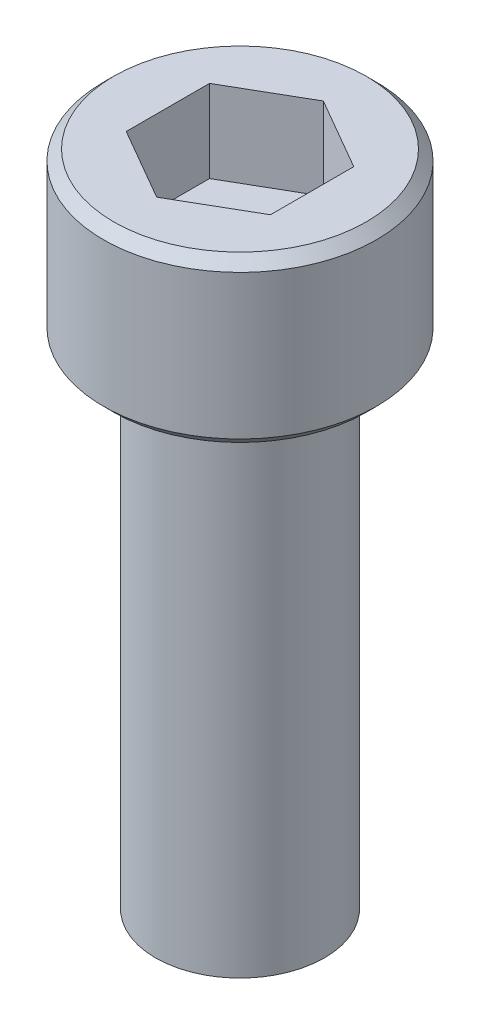
ISO-10303-21;
HEADER;
FILE_DESCRIPTION(('STEP AP214'),'2;1');
FILE_NAME('part.step','',(''),(''),'','','');
FILE_SCHEMA(('AUTOMOTIVE_DESIGN { 1 0 10303 214 1 1 1 1 }'));
ENDSEC;
DATA;
#1=APPLICATION_CONTEXT('core data for automotive mechanical design processes');
#2=APPLICATION_PROTOCOL_DEFINITION('international standard','automotive_design',2000,#1);
#3=PRODUCT_CONTEXT('',#1,'mechanical');
#4=PRODUCT('Part','Part','',(#3));
#5=PRODUCT_RELATED_PRODUCT_CATEGORY('part','',(#4));
#6=PRODUCT_DEFINITION_FORMATION('','',#4);
#7=PRODUCT_DEFINITION_CONTEXT('part definition',#1,'design');
#8=PRODUCT_DEFINITION('design','',#6,#7);
#9=PRODUCT_DEFINITION_SHAPE('','',#8);
#10=(LENGTH_UNIT() NAMED_UNIT(*) SI_UNIT(.MILLI.,.METRE.));
#11=(NAMED_UNIT(*) PLANE_ANGLE_UNIT() SI_UNIT($,.RADIAN.));
#12=(NAMED_UNIT(*) SI_UNIT($,.STERADIAN.) SOLID_ANGLE_UNIT());
#13=UNCERTAINTY_MEASURE_WITH_UNIT(LENGTH_MEASURE(1.E-05),#10,'distance_accuracy_value','');
#14=(GEOMETRIC_REPRESENTATION_CONTEXT(3) GLOBAL_UNCERTAINTY_ASSIGNED_CONTEXT((#13)) GLOBAL_UNIT_ASSIGNED_CONTEXT((#10,
#11,#12)) REPRESENTATION_CONTEXT('',''));
#15=CARTESIAN_POINT('',(0.,0.,0.));
#16=DIRECTION('',(0.,0.,1.));
#17=DIRECTION('',(1.,0.,0.));
#18=AXIS2_PLACEMENT_3D('',#15,#16,#17);
#19=CARTESIAN_POINT('',(0.,4.06400000000001,0.));
#20=DIRECTION('',(0.,-1.,0.));
#21=DIRECTION('',(1.,0.,0.));
#22=AXIS2_PLACEMENT_3D('',#19,#20,#21);
#23=CYLINDRICAL_SURFACE('',#22,3.3655);
#24=CARTESIAN_POINT('',(0.,3.81000000001602,0.));
#25=DIRECTION('',(0.,1.,0.));
#26=DIRECTION('',(-1.,0.,0.));
#27=AXIS2_PLACEMENT_3D('',#24,#25,#26);
#28=CIRCLE('',#27,3.3655);
#29=CARTESIAN_POINT('',(-3.3655,3.81000000001602,0.));
#30=VERTEX_POINT('',#29);
#31=EDGE_CURVE('E154',#30,#30,#28,.F.);
#32=ORIENTED_EDGE('',*,*,#31,.T.);
#33=EDGE_LOOP('',(#32));
#34=FACE_BOUND('',#33,.T.);
#35=CARTESIAN_POINT('',(0.,0.253999999983988,0.));
#36=DIRECTION('',(0.,-1.,0.));
#37=DIRECTION('',(1.,0.,0.));
#38=AXIS2_PLACEMENT_3D('',#35,#36,#37);
#39=CIRCLE('',#38,3.3655);
#40=CARTESIAN_POINT('',(3.3655,0.253999999983988,0.));
#41=VERTEX_POINT('',#40);
#42=EDGE_CURVE('E151',#41,#41,#39,.F.);
#43=ORIENTED_EDGE('',*,*,#42,.T.);
#44=EDGE_LOOP('',(#43));
#45=FACE_BOUND('',#44,.T.);
#46=ADVANCED_FACE('F40',(#34,#45),#23,.T.);
#47=CARTESIAN_POINT('',(3.3655,4.06400000000001,0.));
#48=DIRECTION('',(0.,1.,0.));
#49=DIRECTION('',(-1.,0.,0.));
#50=AXIS2_PLACEMENT_3D('',#47,#48,#49);
#51=PLANE('',#50);
#52=CARTESIAN_POINT('',(0.,4.06400000000001,0.));
#53=DIRECTION('',(0.,1.,0.));
#54=DIRECTION('',(-1.,0.,0.));
#55=AXIS2_PLACEMENT_3D('',#52,#53,#54);
#56=CIRCLE('',#55,3.11150000001601);
#57=CARTESIAN_POINT('',(-3.11150000001601,4.06400000000001,0.));
#58=VERTEX_POINT('',#57);
#59=EDGE_CURVE('E157',#58,#58,#56,.T.);
#60=ORIENTED_EDGE('',*,*,#59,.T.);
#61=EDGE_LOOP('',(#60));
#62=FACE_BOUND('',#61,.T.);
#63=DIRECTION('',(0.,0.,-1.));
#64=VECTOR('',#63,1.);
#65=CARTESIAN_POINT('',(1.77799999999999,4.06400000000001,1.02652877861915));
#66=LINE('',#65,#64);
#67=CARTESIAN_POINT('',(1.77799999999999,4.06400000000001,1.02652877861915));
#68=VERTEX_POINT('',#67);
#69=CARTESIAN_POINT('',(1.77799999999999,4.06400000000001,-1.02652877861916));
#70=VERTEX_POINT('',#69);
#71=EDGE_CURVE('E56',#68,#70,#66,.T.);
#72=ORIENTED_EDGE('',*,*,#71,.F.);
#73=DIRECTION('',(0.866025403784439,0.,-0.499999999999999));
#74=VECTOR('',#73,1.);
#75=CARTESIAN_POINT('',(0.,4.06400000000001,2.05305755723831));
#76=LINE('',#75,#74);
#77=CARTESIAN_POINT('',(0.,4.06400000000001,2.05305755723831));
#78=VERTEX_POINT('',#77);
#79=EDGE_CURVE('E139',#78,#68,#76,.T.);
#80=ORIENTED_EDGE('',*,*,#79,.F.);
#81=DIRECTION('',(0.866025403784438,0.,0.5));
#82=VECTOR('',#81,1.);
#83=CARTESIAN_POINT('',(-1.778,4.06400000000001,1.02652877861915));
#84=LINE('',#83,#82);
#85=CARTESIAN_POINT('',(-1.778,4.06400000000001,1.02652877861915));
#86=VERTEX_POINT('',#85);
#87=EDGE_CURVE('E137',#86,#78,#84,.T.);
#88=ORIENTED_EDGE('',*,*,#87,.F.);
#89=DIRECTION('',(0.,0.,1.));
#90=VECTOR('',#89,1.);
#91=CARTESIAN_POINT('',(-1.778,4.06400000000001,-1.02652877861915));
#92=LINE('',#91,#90);
#93=CARTESIAN_POINT('',(-1.778,4.06400000000001,-1.02652877861915));
#94=VERTEX_POINT('',#93);
#95=EDGE_CURVE('E104',#94,#86,#92,.T.);
#96=ORIENTED_EDGE('',*,*,#95,.F.);
#97=DIRECTION('',(-0.866025403784439,0.,0.5));
#98=VECTOR('',#97,1.);
#99=CARTESIAN_POINT('',(0.,4.06400000000001,-2.0530575572383));
#100=LINE('',#99,#98);
#101=CARTESIAN_POINT('',(0.,4.06400000000001,-2.0530575572383));
#102=VERTEX_POINT('',#101);
#103=EDGE_CURVE('E133',#102,#94,#100,.T.);
#104=ORIENTED_EDGE('',*,*,#103,.F.);
#105=DIRECTION('',(-0.866025403784442,0.,-0.499999999999994));
#106=VECTOR('',#105,1.);
#107=CARTESIAN_POINT('',(1.77799999999999,4.06400000000001,-1.02652877861916));
#108=LINE('',#107,#106);
#109=EDGE_CURVE('E130',#70,#102,#108,.T.);
#110=ORIENTED_EDGE('',*,*,#109,.F.);
#111=EDGE_LOOP('',(#72,#80,#88,#96,#104,#110));
#112=FACE_BOUND('',#111,.T.);
#113=ADVANCED_FACE('F177',(#62,#112),#51,.T.);
#114=CARTESIAN_POINT('',(0.,0.,0.));
#115=DIRECTION('',(0.,-1.,0.));
#116=DIRECTION('',(1.,0.,0.));
#117=AXIS2_PLACEMENT_3D('',#114,#115,#116);
#118=PLANE('',#117);
#119=CARTESIAN_POINT('',(0.,0.,0.));
#120=DIRECTION('',(0.,-1.,0.));
#121=DIRECTION('',(1.,0.,0.));
#122=AXIS2_PLACEMENT_3D('',#119,#120,#121);
#123=CIRCLE('',#122,3.11150000001602);
#124=CARTESIAN_POINT('',(3.11150000001602,0.,0.));
#125=VERTEX_POINT('',#124);
#126=EDGE_CURVE('E160',#125,#125,#123,.T.);
#127=ORIENTED_EDGE('',*,*,#126,.T.);
#128=EDGE_LOOP('',(#127));
#129=FACE_BOUND('',#128,.T.);
#130=CARTESIAN_POINT('',(0.,0.,0.));
#131=DIRECTION('',(0.,-1.,0.));
#132=DIRECTION('',(1.,0.,0.));
#133=AXIS2_PLACEMENT_3D('',#130,#131,#132);
#134=CIRCLE('',#133,2.0828);
#135=CARTESIAN_POINT('',(2.0828,0.,0.));
#136=VERTEX_POINT('',#135);
#137=EDGE_CURVE('E143',#136,#136,#134,.T.);
#138=ORIENTED_EDGE('',*,*,#137,.F.);
#139=EDGE_LOOP('',(#138));
#140=FACE_BOUND('',#139,.T.);
#141=ADVANCED_FACE('F183',(#129,#140),#118,.T.);
#142=CARTESIAN_POINT('',(0.,-12.7,0.));
#143=DIRECTION('',(0.,1.,0.));
#144=DIRECTION('',(-1.,0.,0.));
#145=AXIS2_PLACEMENT_3D('',#142,#143,#144);
#146=CYLINDRICAL_SURFACE('',#145,2.0828);
#147=CARTESIAN_POINT('',(0.,-12.1615200000393,0.));
#148=DIRECTION('',(0.,-1.,0.));
#149=DIRECTION('',(1.,0.,0.));
#150=AXIS2_PLACEMENT_3D('',#147,#148,#149);
#151=CIRCLE('',#150,2.0828);
#152=CARTESIAN_POINT('',(2.0828,-12.1615200000393,0.));
#153=VERTEX_POINT('',#152);
#154=EDGE_CURVE('E11',#153,#153,#151,.F.);
#155=ORIENTED_EDGE('',*,*,#154,.T.);
#156=EDGE_LOOP('',(#155));
#157=FACE_BOUND('',#156,.T.);
#158=ORIENTED_EDGE('',*,*,#137,.T.);
#159=EDGE_LOOP('',(#158));
#160=FACE_BOUND('',#159,.T.);
#161=ADVANCED_FACE('F222',(#157,#160),#146,.T.);
#162=CARTESIAN_POINT('',(0.,-12.7,0.));
#163=DIRECTION('',(0.,-1.,0.));
#164=DIRECTION('',(1.,0.,0.));
#165=AXIS2_PLACEMENT_3D('',#162,#163,#164);
#166=PLANE('',#165);
#167=CARTESIAN_POINT('',(0.,-12.7,0.));
#168=DIRECTION('',(0.,-1.,0.));
#169=DIRECTION('',(1.,0.,0.));
#170=AXIS2_PLACEMENT_3D('',#167,#168,#169);
#171=CIRCLE('',#170,1.31318000004432);
#172=CARTESIAN_POINT('',(1.31318000004432,-12.7,0.));
#173=VERTEX_POINT('',#172);
#174=EDGE_CURVE('E49',#173,#173,#171,.T.);
#175=ORIENTED_EDGE('',*,*,#174,.T.);
#176=EDGE_LOOP('',(#175));
#177=FACE_BOUND('',#176,.T.);
#178=ADVANCED_FACE('F165',(#177),#166,.T.);
#179=CARTESIAN_POINT('',(1.77799999999999,2.03200000000001,1.02652877861915));
#180=DIRECTION('',(1.,0.,0.));
#181=DIRECTION('',(0.,0.,-1.));
#182=AXIS2_PLACEMENT_3D('',#179,#180,#181);
#183=PLANE('',#182);
#184=ORIENTED_EDGE('',*,*,#71,.T.);
#185=DIRECTION('',(0.,1.,0.));
#186=VECTOR('',#185,1.);
#187=CARTESIAN_POINT('',(1.77799999999999,2.03200000000001,-1.02652877861916));
#188=LINE('',#187,#186);
#189=CARTESIAN_POINT('',(1.77799999999999,2.03200000000001,-1.02652877861916));
#190=VERTEX_POINT('',#189);
#191=EDGE_CURVE('E86',#190,#70,#188,.T.);
#192=ORIENTED_EDGE('',*,*,#191,.F.);
#193=DIRECTION('',(0.,0.,-1.));
#194=VECTOR('',#193,1.);
#195=CARTESIAN_POINT('',(1.77799999999999,2.03200000000001,1.02652877861915));
#196=LINE('',#195,#194);
#197=CARTESIAN_POINT('',(1.77799999999999,2.03200000000001,1.02652877861915));
#198=VERTEX_POINT('',#197);
#199=EDGE_CURVE('E141',#198,#190,#196,.T.);
#200=ORIENTED_EDGE('',*,*,#199,.F.);
#201=DIRECTION('',(0.,1.,0.));
#202=VECTOR('',#201,1.);
#203=CARTESIAN_POINT('',(1.77799999999999,2.03200000000001,1.02652877861915));
#204=LINE('',#203,#202);
#205=EDGE_CURVE('E64',#198,#68,#204,.T.);
#206=ORIENTED_EDGE('',*,*,#205,.T.);
#207=EDGE_LOOP('',(#184,#192,#200,#206));
#208=FACE_BOUND('',#207,.T.);
#209=ADVANCED_FACE('F213',(#208),#183,.F.);
#210=CARTESIAN_POINT('',(0.,2.03200000000001,2.05305755723831));
#211=DIRECTION('',(0.499999999999999,0.,0.866025403784439));
#212=DIRECTION('',(0.866025403784439,0.,-0.499999999999999));
#213=AXIS2_PLACEMENT_3D('',#210,#211,#212);
#214=PLANE('',#213);
#215=ORIENTED_EDGE('',*,*,#79,.T.);
#216=ORIENTED_EDGE('',*,*,#205,.F.);
#217=DIRECTION('',(0.866025403784439,0.,-0.499999999999999));
#218=VECTOR('',#217,1.);
#219=CARTESIAN_POINT('',(0.,2.03200000000001,2.05305755723831));
#220=LINE('',#219,#218);
#221=CARTESIAN_POINT('',(0.,2.03200000000001,2.05305755723831));
#222=VERTEX_POINT('',#221);
#223=EDGE_CURVE('E116',#222,#198,#220,.T.);
#224=ORIENTED_EDGE('',*,*,#223,.F.);
#225=DIRECTION('',(0.,1.,0.));
#226=VECTOR('',#225,1.);
#227=CARTESIAN_POINT('',(0.,2.03200000000001,2.05305755723831));
#228=LINE('',#227,#226);
#229=EDGE_CURVE('E108',#222,#78,#228,.T.);
#230=ORIENTED_EDGE('',*,*,#229,.T.);
#231=EDGE_LOOP('',(#215,#216,#224,#230));
#232=FACE_BOUND('',#231,.T.);
#233=ADVANCED_FACE('F215',(#232),#214,.F.);
#234=CARTESIAN_POINT('',(-1.778,2.03200000000001,1.02652877861915));
#235=DIRECTION('',(-0.5,0.,0.866025403784438));
#236=DIRECTION('',(0.866025403784438,0.,0.5));
#237=AXIS2_PLACEMENT_3D('',#234,#235,#236);
#238=PLANE('',#237);
#239=ORIENTED_EDGE('',*,*,#87,.T.);
#240=ORIENTED_EDGE('',*,*,#229,.F.);
#241=DIRECTION('',(0.866025403784438,0.,0.5));
#242=VECTOR('',#241,1.);
#243=CARTESIAN_POINT('',(-1.778,2.03200000000001,1.02652877861915));
#244=LINE('',#243,#242);
#245=CARTESIAN_POINT('',(-1.778,2.03200000000001,1.02652877861915));
#246=VERTEX_POINT('',#245);
#247=EDGE_CURVE('E112',#246,#222,#244,.T.);
#248=ORIENTED_EDGE('',*,*,#247,.F.);
#249=DIRECTION('',(0.,1.,0.));
#250=VECTOR('',#249,1.);
#251=CARTESIAN_POINT('',(-1.778,2.03200000000001,1.02652877861915));
#252=LINE('',#251,#250);
#253=EDGE_CURVE('E97',#246,#86,#252,.T.);
#254=ORIENTED_EDGE('',*,*,#253,.T.);
#255=EDGE_LOOP('',(#239,#240,#248,#254));
#256=FACE_BOUND('',#255,.T.);
#257=ADVANCED_FACE('F113',(#256),#238,.F.);
#258=CARTESIAN_POINT('',(-1.778,2.03200000000001,-1.02652877861915));
#259=DIRECTION('',(-1.,0.,0.));
#260=DIRECTION('',(0.,0.,1.));
#261=AXIS2_PLACEMENT_3D('',#258,#259,#260);
#262=PLANE('',#261);
#263=ORIENTED_EDGE('',*,*,#95,.T.);
#264=ORIENTED_EDGE('',*,*,#253,.F.);
#265=DIRECTION('',(0.,0.,1.));
#266=VECTOR('',#265,1.);
#267=CARTESIAN_POINT('',(-1.778,2.03200000000001,-1.02652877861915));
#268=LINE('',#267,#266);
#269=CARTESIAN_POINT('',(-1.778,2.03200000000001,-1.02652877861915));
#270=VERTEX_POINT('',#269);
#271=EDGE_CURVE('E101',#270,#246,#268,.T.);
#272=ORIENTED_EDGE('',*,*,#271,.F.);
#273=DIRECTION('',(0.,1.,0.));
#274=VECTOR('',#273,1.);
#275=CARTESIAN_POINT('',(-1.778,2.03200000000001,-1.02652877861915));
#276=LINE('',#275,#274);
#277=EDGE_CURVE('E109',#270,#94,#276,.T.);
#278=ORIENTED_EDGE('',*,*,#277,.T.);
#279=EDGE_LOOP('',(#263,#264,#272,#278));
#280=FACE_BOUND('',#279,.T.);
#281=ADVANCED_FACE('F99',(#280),#262,.F.);
#282=CARTESIAN_POINT('',(0.,2.03200000000001,-2.0530575572383));
#283=DIRECTION('',(-0.5,0.,-0.866025403784439));
#284=DIRECTION('',(-0.866025403784439,0.,0.5));
#285=AXIS2_PLACEMENT_3D('',#282,#283,#284);
#286=PLANE('',#285);
#287=ORIENTED_EDGE('',*,*,#103,.T.);
#288=ORIENTED_EDGE('',*,*,#277,.F.);
#289=DIRECTION('',(-0.866025403784439,0.,0.5));
#290=VECTOR('',#289,1.);
#291=CARTESIAN_POINT('',(0.,2.03200000000001,-2.0530575572383));
#292=LINE('',#291,#290);
#293=CARTESIAN_POINT('',(0.,2.03200000000001,-2.0530575572383));
#294=VERTEX_POINT('',#293);
#295=EDGE_CURVE('E122',#294,#270,#292,.T.);
#296=ORIENTED_EDGE('',*,*,#295,.F.);
#297=DIRECTION('',(0.,1.,0.));
#298=VECTOR('',#297,1.);
#299=CARTESIAN_POINT('',(0.,2.03200000000001,-2.0530575572383));
#300=LINE('',#299,#298);
#301=EDGE_CURVE('E146',#294,#102,#300,.T.);
#302=ORIENTED_EDGE('',*,*,#301,.T.);
#303=EDGE_LOOP('',(#287,#288,#296,#302));
#304=FACE_BOUND('',#303,.T.);
#305=ADVANCED_FACE('F277',(#304),#286,.F.);
#306=CARTESIAN_POINT('',(1.77799999999999,2.03200000000001,-1.02652877861916));
#307=DIRECTION('',(0.499999999999994,0.,-0.866025403784442));
#308=DIRECTION('',(-0.866025403784442,0.,-0.499999999999994));
#309=AXIS2_PLACEMENT_3D('',#306,#307,#308);
#310=PLANE('',#309);
#311=ORIENTED_EDGE('',*,*,#109,.T.);
#312=ORIENTED_EDGE('',*,*,#301,.F.);
#313=DIRECTION('',(-0.866025403784442,0.,-0.499999999999994));
#314=VECTOR('',#313,1.);
#315=CARTESIAN_POINT('',(1.77799999999999,2.03200000000001,-1.02652877861916));
#316=LINE('',#315,#314);
#317=EDGE_CURVE('E124',#190,#294,#316,.T.);
#318=ORIENTED_EDGE('',*,*,#317,.F.);
#319=ORIENTED_EDGE('',*,*,#191,.T.);
#320=EDGE_LOOP('',(#311,#312,#318,#319));
#321=FACE_BOUND('',#320,.T.);
#322=ADVANCED_FACE('F202',(#321),#310,.F.);
#323=CARTESIAN_POINT('',(0.,2.03200000000001,0.));
#324=DIRECTION('',(0.,1.,0.));
#325=DIRECTION('',(0.,0.,1.));
#326=AXIS2_PLACEMENT_3D('',#323,#324,#325);
#327=PLANE('',#326);
#328=ORIENTED_EDGE('',*,*,#199,.T.);
#329=ORIENTED_EDGE('',*,*,#317,.T.);
#330=ORIENTED_EDGE('',*,*,#295,.T.);
#331=ORIENTED_EDGE('',*,*,#271,.T.);
#332=ORIENTED_EDGE('',*,*,#247,.T.);
#333=ORIENTED_EDGE('',*,*,#223,.T.);
#334=EDGE_LOOP('',(#328,#329,#330,#331,#332,#333));
#335=FACE_BOUND('',#334,.T.);
#336=ADVANCED_FACE('F119',(#335),#327,.T.);
#337=CARTESIAN_POINT('',(0.,3.81000000001602,0.));
#338=DIRECTION('',(0.,-1.,0.));
#339=DIRECTION('',(1.,0.,0.));
#340=AXIS2_PLACEMENT_3D('',#337,#338,#339);
#341=CONICAL_SURFACE('',#340,3.3655,0.785398163397452);
#342=ORIENTED_EDGE('',*,*,#59,.F.);
#343=EDGE_LOOP('',(#342));
#344=FACE_BOUND('',#343,.T.);
#345=ORIENTED_EDGE('',*,*,#31,.F.);
#346=EDGE_LOOP('',(#345));
#347=FACE_BOUND('',#346,.T.);
#348=ADVANCED_FACE('F173',(#344,#347),#341,.T.);
#349=CARTESIAN_POINT('',(0.,0.,0.));
#350=DIRECTION('',(0.,1.,0.));
#351=DIRECTION('',(-1.,0.,0.));
#352=AXIS2_PLACEMENT_3D('',#349,#350,#351);
#353=CONICAL_SURFACE('',#352,3.11150000001602,0.785398163397436);
#354=ORIENTED_EDGE('',*,*,#42,.F.);
#355=EDGE_LOOP('',(#354));
#356=FACE_BOUND('',#355,.T.);
#357=ORIENTED_EDGE('',*,*,#126,.F.);
#358=EDGE_LOOP('',(#357));
#359=FACE_BOUND('',#358,.T.);
#360=ADVANCED_FACE('F168',(#356,#359),#353,.T.);
#361=CARTESIAN_POINT('',(0.,-12.7,0.));
#362=DIRECTION('',(0.,1.,0.));
#363=DIRECTION('',(-1.,0.,0.));
#364=AXIS2_PLACEMENT_3D('',#361,#362,#363);
#365=CONICAL_SURFACE('',#364,1.31318000004432,0.960291895417686);
#366=ORIENTED_EDGE('',*,*,#154,.F.);
#367=EDGE_LOOP('',(#366));
#368=FACE_BOUND('',#367,.T.);
#369=ORIENTED_EDGE('',*,*,#174,.F.);
#370=EDGE_LOOP('',(#369));
#371=FACE_BOUND('',#370,.T.);
#372=ADVANCED_FACE('F43',(#368,#371),#365,.T.);
#373=CLOSED_SHELL('',(#46,#113,#141,#161,#178,#209,#233,#257,#281,#305,#322,#336,#348,#360,#372));
#374=MANIFOLD_SOLID_BREP('B2',#373);
#375=ADVANCED_BREP_SHAPE_REPRESENTATION('',(#18,#374),#14);
#376=SHAPE_DEFINITION_REPRESENTATION(#9,#375);
ENDSEC;
END-ISO-10303-21;
